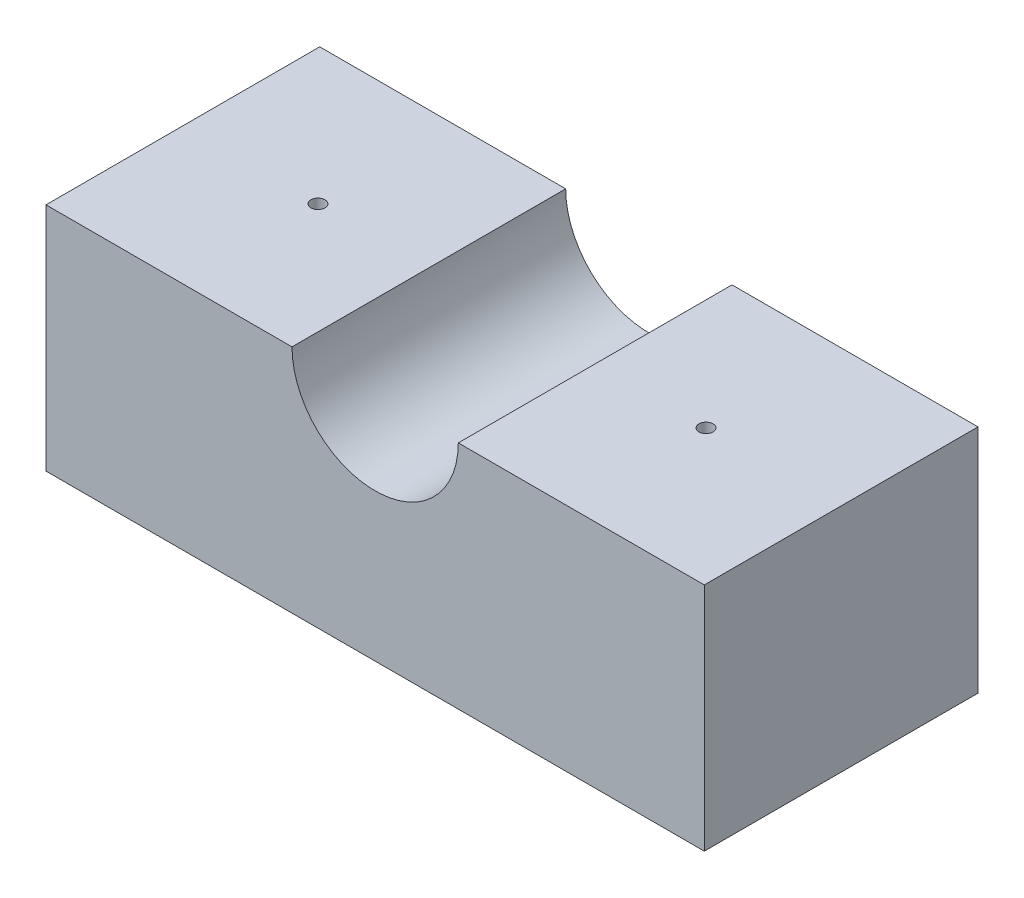
ISO-10303-21;
HEADER;
FILE_DESCRIPTION(('STEP AP214'),'2;1');
FILE_NAME('part.step','',(''),(''),'','','');
FILE_SCHEMA(('AUTOMOTIVE_DESIGN { 1 0 10303 214 1 1 1 1 }'));
ENDSEC;
DATA;
#1=APPLICATION_CONTEXT('core data for automotive mechanical design processes');
#2=APPLICATION_PROTOCOL_DEFINITION('international standard','automotive_design',2000,#1);
#3=PRODUCT_CONTEXT('',#1,'mechanical');
#4=PRODUCT('Part','Part','',(#3));
#5=PRODUCT_RELATED_PRODUCT_CATEGORY('part','',(#4));
#6=PRODUCT_DEFINITION_FORMATION('','',#4);
#7=PRODUCT_DEFINITION_CONTEXT('part definition',#1,'design');
#8=PRODUCT_DEFINITION('design','',#6,#7);
#9=PRODUCT_DEFINITION_SHAPE('','',#8);
#10=(LENGTH_UNIT() NAMED_UNIT(*) SI_UNIT(.MILLI.,.METRE.));
#11=(NAMED_UNIT(*) PLANE_ANGLE_UNIT() SI_UNIT($,.RADIAN.));
#12=(NAMED_UNIT(*) SI_UNIT($,.STERADIAN.) SOLID_ANGLE_UNIT());
#13=UNCERTAINTY_MEASURE_WITH_UNIT(LENGTH_MEASURE(1.E-05),#10,'distance_accuracy_value','');
#14=(GEOMETRIC_REPRESENTATION_CONTEXT(3) GLOBAL_UNCERTAINTY_ASSIGNED_CONTEXT((#13)) GLOBAL_UNIT_ASSIGNED_CONTEXT((#10,
#11,#12)) REPRESENTATION_CONTEXT('',''));
#15=CARTESIAN_POINT('',(0.,0.,0.));
#16=DIRECTION('',(0.,0.,1.));
#17=DIRECTION('',(1.,0.,0.));
#18=AXIS2_PLACEMENT_3D('',#15,#16,#17);
#19=CARTESIAN_POINT('',(0.,8.3185,0.));
#20=DIRECTION('',(0.,-1.,0.));
#21=DIRECTION('',(0.,0.,-1.));
#22=AXIS2_PLACEMENT_3D('',#19,#20,#21);
#23=PLANE('',#22);
#24=CARTESIAN_POINT('',(6.99999997,8.3185,0.));
#25=DIRECTION('',(0.,1.,0.));
#26=DIRECTION('',(0.,0.,-1.));
#27=AXIS2_PLACEMENT_3D('',#24,#25,#26);
#28=CIRCLE('',#27,0.254);
#29=CARTESIAN_POINT('',(6.99999997,8.3185,-0.254000000000003));
#30=VERTEX_POINT('',#29);
#31=EDGE_CURVE('E169',#30,#30,#28,.T.);
#32=ORIENTED_EDGE('',*,*,#31,.F.);
#33=EDGE_LOOP('',(#32));
#34=FACE_BOUND('',#33,.T.);
#35=DIRECTION('',(1.,0.,0.));
#36=VECTOR('',#35,1.);
#37=CARTESIAN_POINT('',(-11.87300013,8.3185,-4.936500033));
#38=LINE('',#37,#36);
#39=CARTESIAN_POINT('',(2.99974,8.3185,-4.936500033));
#40=VERTEX_POINT('',#39);
#41=CARTESIAN_POINT('',(11.87300013,8.3185,-4.936500033));
#42=VERTEX_POINT('',#41);
#43=EDGE_CURVE('E114',#40,#42,#38,.T.);
#44=ORIENTED_EDGE('',*,*,#43,.F.);
#45=DIRECTION('',(0.,0.,1.));
#46=VECTOR('',#45,1.);
#47=CARTESIAN_POINT('',(2.99974,8.3185,-4.936500033));
#48=LINE('',#47,#46);
#49=CARTESIAN_POINT('',(2.99974,8.3185,4.936500033));
#50=VERTEX_POINT('',#49);
#51=EDGE_CURVE('E11',#40,#50,#48,.T.);
#52=ORIENTED_EDGE('',*,*,#51,.T.);
#53=DIRECTION('',(-1.,0.,0.));
#54=VECTOR('',#53,1.);
#55=CARTESIAN_POINT('',(11.87300013,8.3185,4.936500033));
#56=LINE('',#55,#54);
#57=CARTESIAN_POINT('',(11.87300013,8.3185,4.936500033));
#58=VERTEX_POINT('',#57);
#59=EDGE_CURVE('E113',#58,#50,#56,.T.);
#60=ORIENTED_EDGE('',*,*,#59,.F.);
#61=DIRECTION('',(0.,0.,1.));
#62=VECTOR('',#61,1.);
#63=CARTESIAN_POINT('',(11.87300013,8.3185,-4.936500033));
#64=LINE('',#63,#62);
#65=EDGE_CURVE('E124',#42,#58,#64,.T.);
#66=ORIENTED_EDGE('',*,*,#65,.F.);
#67=EDGE_LOOP('',(#44,#52,#60,#66));
#68=FACE_BOUND('',#67,.T.);
#69=ADVANCED_FACE('F43',(#34,#68),#23,.F.);
#70=CARTESIAN_POINT('',(-11.87300013,8.3185,4.936500033));
#71=DIRECTION('',(-1.,0.,0.));
#72=DIRECTION('',(0.,0.,1.));
#73=AXIS2_PLACEMENT_3D('',#70,#71,#72);
#74=PLANE('',#73);
#75=DIRECTION('',(0.,0.,-1.));
#76=VECTOR('',#75,1.);
#77=CARTESIAN_POINT('',(-11.87300013,0.,4.936500033));
#78=LINE('',#77,#76);
#79=CARTESIAN_POINT('',(-11.87300013,0.,4.936500033));
#80=VERTEX_POINT('',#79);
#81=CARTESIAN_POINT('',(-11.87300013,0.,-4.936500033));
#82=VERTEX_POINT('',#81);
#83=EDGE_CURVE('E128',#80,#82,#78,.T.);
#84=ORIENTED_EDGE('',*,*,#83,.F.);
#85=DIRECTION('',(0.,-1.,0.));
#86=VECTOR('',#85,1.);
#87=CARTESIAN_POINT('',(-11.87300013,8.3185,4.936500033));
#88=LINE('',#87,#86);
#89=CARTESIAN_POINT('',(-11.87300013,8.3185,4.936500033));
#90=VERTEX_POINT('',#89);
#91=EDGE_CURVE('E87',#90,#80,#88,.T.);
#92=ORIENTED_EDGE('',*,*,#91,.F.);
#93=DIRECTION('',(0.,0.,-1.));
#94=VECTOR('',#93,1.);
#95=CARTESIAN_POINT('',(-11.87300013,8.3185,4.936500033));
#96=LINE('',#95,#94);
#97=CARTESIAN_POINT('',(-11.87300013,8.3185,-4.936500033));
#98=VERTEX_POINT('',#97);
#99=EDGE_CURVE('E144',#90,#98,#96,.T.);
#100=ORIENTED_EDGE('',*,*,#99,.T.);
#101=DIRECTION('',(0.,-1.,0.));
#102=VECTOR('',#101,1.);
#103=CARTESIAN_POINT('',(-11.87300013,8.3185,-4.936500033));
#104=LINE('',#103,#102);
#105=EDGE_CURVE('E94',#98,#82,#104,.T.);
#106=ORIENTED_EDGE('',*,*,#105,.T.);
#107=EDGE_LOOP('',(#84,#92,#100,#106));
#108=FACE_BOUND('',#107,.T.);
#109=ADVANCED_FACE('F45',(#108),#74,.T.);
#110=CARTESIAN_POINT('',(11.87300013,8.3185,4.936500033));
#111=DIRECTION('',(0.,0.,1.));
#112=DIRECTION('',(1.,0.,0.));
#113=AXIS2_PLACEMENT_3D('',#110,#111,#112);
#114=PLANE('',#113);
#115=CARTESIAN_POINT('',(0.,8.3185,4.936500033));
#116=DIRECTION('',(0.,0.,1.));
#117=DIRECTION('',(1.,0.,0.));
#118=AXIS2_PLACEMENT_3D('',#115,#116,#117);
#119=CIRCLE('',#118,2.99974);
#120=CARTESIAN_POINT('',(-2.99974,8.3185,4.936500033));
#121=VERTEX_POINT('',#120);
#122=EDGE_CURVE('E103',#121,#50,#119,.T.);
#123=ORIENTED_EDGE('',*,*,#122,.F.);
#124=EDGE_CURVE('E68',#121,#90,#56,.T.);
#125=ORIENTED_EDGE('',*,*,#124,.T.);
#126=ORIENTED_EDGE('',*,*,#91,.T.);
#127=DIRECTION('',(-1.,0.,0.));
#128=VECTOR('',#127,1.);
#129=CARTESIAN_POINT('',(11.87300013,0.,4.936500033));
#130=LINE('',#129,#128);
#131=CARTESIAN_POINT('',(11.87300013,0.,4.936500033));
#132=VERTEX_POINT('',#131);
#133=EDGE_CURVE('E140',#132,#80,#130,.T.);
#134=ORIENTED_EDGE('',*,*,#133,.F.);
#135=DIRECTION('',(0.,-1.,0.));
#136=VECTOR('',#135,1.);
#137=CARTESIAN_POINT('',(11.87300013,8.3185,4.936500033));
#138=LINE('',#137,#136);
#139=EDGE_CURVE('E116',#58,#132,#138,.T.);
#140=ORIENTED_EDGE('',*,*,#139,.F.);
#141=ORIENTED_EDGE('',*,*,#59,.T.);
#142=EDGE_LOOP('',(#123,#125,#126,#134,#140,#141));
#143=FACE_BOUND('',#142,.T.);
#144=ADVANCED_FACE('F115',(#143),#114,.T.);
#145=CARTESIAN_POINT('',(11.87300013,8.3185,-4.936500033));
#146=DIRECTION('',(1.,0.,0.));
#147=DIRECTION('',(0.,0.,-1.));
#148=AXIS2_PLACEMENT_3D('',#145,#146,#147);
#149=PLANE('',#148);
#150=DIRECTION('',(0.,0.,1.));
#151=VECTOR('',#150,1.);
#152=CARTESIAN_POINT('',(11.87300013,0.,-4.936500033));
#153=LINE('',#152,#151);
#154=CARTESIAN_POINT('',(11.87300013,0.,-4.936500033));
#155=VERTEX_POINT('',#154);
#156=EDGE_CURVE('E136',#155,#132,#153,.T.);
#157=ORIENTED_EDGE('',*,*,#156,.F.);
#158=DIRECTION('',(0.,-1.,0.));
#159=VECTOR('',#158,1.);
#160=CARTESIAN_POINT('',(11.87300013,8.3185,-4.936500033));
#161=LINE('',#160,#159);
#162=EDGE_CURVE('E122',#42,#155,#161,.T.);
#163=ORIENTED_EDGE('',*,*,#162,.F.);
#164=ORIENTED_EDGE('',*,*,#65,.T.);
#165=ORIENTED_EDGE('',*,*,#139,.T.);
#166=EDGE_LOOP('',(#157,#163,#164,#165));
#167=FACE_BOUND('',#166,.T.);
#168=ADVANCED_FACE('F198',(#167),#149,.T.);
#169=CARTESIAN_POINT('',(-11.87300013,8.3185,-4.936500033));
#170=DIRECTION('',(0.,0.,-1.));
#171=DIRECTION('',(-1.,0.,0.));
#172=AXIS2_PLACEMENT_3D('',#169,#170,#171);
#173=PLANE('',#172);
#174=CARTESIAN_POINT('',(0.,8.3185,-4.936500033));
#175=DIRECTION('',(0.,0.,1.));
#176=DIRECTION('',(1.,0.,0.));
#177=AXIS2_PLACEMENT_3D('',#174,#175,#176);
#178=CIRCLE('',#177,2.99974);
#179=CARTESIAN_POINT('',(-2.99974,8.3185,-4.936500033));
#180=VERTEX_POINT('',#179);
#181=EDGE_CURVE('E59',#180,#40,#178,.T.);
#182=ORIENTED_EDGE('',*,*,#181,.T.);
#183=ORIENTED_EDGE('',*,*,#43,.T.);
#184=ORIENTED_EDGE('',*,*,#162,.T.);
#185=DIRECTION('',(1.,0.,0.));
#186=VECTOR('',#185,1.);
#187=CARTESIAN_POINT('',(-11.87300013,0.,-4.936500033));
#188=LINE('',#187,#186);
#189=EDGE_CURVE('E132',#82,#155,#188,.T.);
#190=ORIENTED_EDGE('',*,*,#189,.F.);
#191=ORIENTED_EDGE('',*,*,#105,.F.);
#192=EDGE_CURVE('E154',#98,#180,#38,.T.);
#193=ORIENTED_EDGE('',*,*,#192,.T.);
#194=EDGE_LOOP('',(#182,#183,#184,#190,#191,#193));
#195=FACE_BOUND('',#194,.T.);
#196=ADVANCED_FACE('F156',(#195),#173,.T.);
#197=CARTESIAN_POINT('',(-6.99999997,8.3185,0.));
#198=DIRECTION('',(0.,1.,0.));
#199=DIRECTION('',(0.,0.,1.));
#200=AXIS2_PLACEMENT_3D('',#197,#198,#199);
#201=CIRCLE('',#200,0.254);
#202=CARTESIAN_POINT('',(-6.99999997,8.3185,0.254000000000001));
#203=VERTEX_POINT('',#202);
#204=EDGE_CURVE('E173',#203,#203,#201,.T.);
#205=ORIENTED_EDGE('',*,*,#204,.F.);
#206=EDGE_LOOP('',(#205));
#207=FACE_BOUND('',#206,.T.);
#208=ORIENTED_EDGE('',*,*,#124,.F.);
#209=DIRECTION('',(0.,0.,1.));
#210=VECTOR('',#209,1.);
#211=CARTESIAN_POINT('',(-2.99974,8.3185,-4.936500033));
#212=LINE('',#211,#210);
#213=EDGE_CURVE('E52',#121,#180,#212,.F.);
#214=ORIENTED_EDGE('',*,*,#213,.T.);
#215=ORIENTED_EDGE('',*,*,#192,.F.);
#216=ORIENTED_EDGE('',*,*,#99,.F.);
#217=EDGE_LOOP('',(#208,#214,#215,#216));
#218=FACE_BOUND('',#217,.T.);
#219=ADVANCED_FACE('F152',(#207,#218),#23,.F.);
#220=CARTESIAN_POINT('',(0.,0.,0.));
#221=DIRECTION('',(0.,-1.,0.));
#222=DIRECTION('',(0.,0.,-1.));
#223=AXIS2_PLACEMENT_3D('',#220,#221,#222);
#224=PLANE('',#223);
#225=ORIENTED_EDGE('',*,*,#83,.T.);
#226=ORIENTED_EDGE('',*,*,#189,.T.);
#227=ORIENTED_EDGE('',*,*,#156,.T.);
#228=ORIENTED_EDGE('',*,*,#133,.T.);
#229=EDGE_LOOP('',(#225,#226,#227,#228));
#230=FACE_BOUND('',#229,.T.);
#231=ADVANCED_FACE('F190',(#230),#224,.T.);
#232=CARTESIAN_POINT('',(0.,8.3185,-4.936500033));
#233=DIRECTION('',(0.,0.,1.));
#234=DIRECTION('',(1.,0.,0.));
#235=AXIS2_PLACEMENT_3D('',#232,#233,#234);
#236=CYLINDRICAL_SURFACE('',#235,2.99974);
#237=ORIENTED_EDGE('',*,*,#181,.F.);
#238=ORIENTED_EDGE('',*,*,#213,.F.);
#239=ORIENTED_EDGE('',*,*,#122,.T.);
#240=ORIENTED_EDGE('',*,*,#51,.F.);
#241=EDGE_LOOP('',(#237,#238,#239,#240));
#242=FACE_BOUND('',#241,.T.);
#243=ADVANCED_FACE('F104',(#242),#236,.F.);
#244=CARTESIAN_POINT('',(-6.99999997,5.7785,0.));
#245=DIRECTION('',(0.,1.,0.));
#246=DIRECTION('',(0.,0.,1.));
#247=AXIS2_PLACEMENT_3D('',#244,#245,#246);
#248=CYLINDRICAL_SURFACE('',#247,0.254);
#249=CARTESIAN_POINT('',(-6.99999997,5.7785,0.));
#250=DIRECTION('',(0.,1.,0.));
#251=DIRECTION('',(0.,0.,1.));
#252=AXIS2_PLACEMENT_3D('',#249,#250,#251);
#253=CIRCLE('',#252,0.254);
#254=CARTESIAN_POINT('',(-6.99999997,5.7785,0.254000000000001));
#255=VERTEX_POINT('',#254);
#256=EDGE_CURVE('E107',#255,#255,#253,.T.);
#257=ORIENTED_EDGE('',*,*,#256,.F.);
#258=EDGE_LOOP('',(#257));
#259=FACE_BOUND('',#258,.T.);
#260=ORIENTED_EDGE('',*,*,#204,.T.);
#261=EDGE_LOOP('',(#260));
#262=FACE_BOUND('',#261,.T.);
#263=ADVANCED_FACE('F183',(#259,#262),#248,.F.);
#264=CARTESIAN_POINT('',(-6.99999997,5.7785,0.));
#265=DIRECTION('',(0.,1.,0.));
#266=DIRECTION('',(0.,0.,1.));
#267=AXIS2_PLACEMENT_3D('',#264,#265,#266);
#268=PLANE('',#267);
#269=ORIENTED_EDGE('',*,*,#256,.T.);
#270=EDGE_LOOP('',(#269));
#271=FACE_BOUND('',#270,.T.);
#272=ADVANCED_FACE('F181',(#271),#268,.T.);
#273=CARTESIAN_POINT('',(6.99999997,5.7785,0.));
#274=DIRECTION('',(0.,1.,0.));
#275=DIRECTION('',(0.,0.,1.));
#276=AXIS2_PLACEMENT_3D('',#273,#274,#275);
#277=CYLINDRICAL_SURFACE('',#276,0.254);
#278=CARTESIAN_POINT('',(6.99999997,5.7785,0.));
#279=DIRECTION('',(0.,1.,0.));
#280=DIRECTION('',(0.,0.,-1.));
#281=AXIS2_PLACEMENT_3D('',#278,#279,#280);
#282=CIRCLE('',#281,0.254);
#283=CARTESIAN_POINT('',(6.99999997,5.7785,-0.254000000000003));
#284=VERTEX_POINT('',#283);
#285=EDGE_CURVE('E165',#284,#284,#282,.T.);
#286=ORIENTED_EDGE('',*,*,#285,.F.);
#287=EDGE_LOOP('',(#286));
#288=FACE_BOUND('',#287,.T.);
#289=ORIENTED_EDGE('',*,*,#31,.T.);
#290=EDGE_LOOP('',(#289));
#291=FACE_BOUND('',#290,.T.);
#292=ADVANCED_FACE('F208',(#288,#291),#277,.F.);
#293=CARTESIAN_POINT('',(6.99999997,5.7785,0.));
#294=DIRECTION('',(0.,-1.,0.));
#295=DIRECTION('',(0.,0.,-1.));
#296=AXIS2_PLACEMENT_3D('',#293,#294,#295);
#297=PLANE('',#296);
#298=ORIENTED_EDGE('',*,*,#285,.T.);
#299=EDGE_LOOP('',(#298));
#300=FACE_BOUND('',#299,.T.);
#301=ADVANCED_FACE('F210',(#300),#297,.F.);
#302=CLOSED_SHELL('',(#69,#109,#144,#168,#196,#219,#231,#243,#263,#272,#292,#301));
#303=MANIFOLD_SOLID_BREP('B2',#302);
#304=ADVANCED_BREP_SHAPE_REPRESENTATION('',(#18,#303),#14);
#305=SHAPE_DEFINITION_REPRESENTATION(#9,#304);
ENDSEC;
END-ISO-10303-21;
